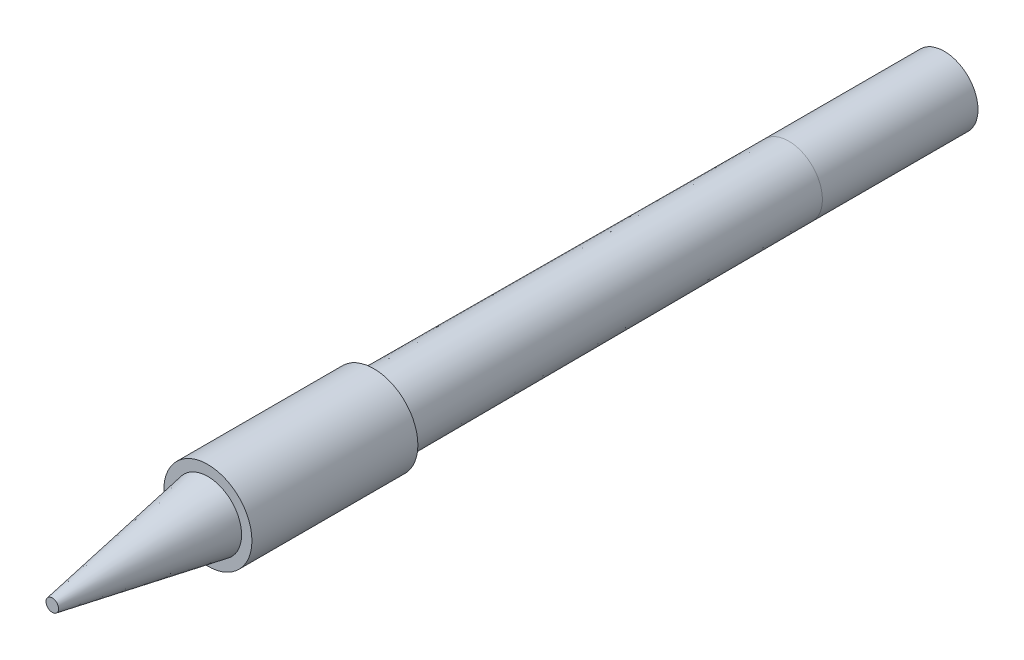
ISO-10303-21;
HEADER;
FILE_DESCRIPTION(('STEP AP214'),'2;1');
FILE_NAME('part.step','',(''),(''),'','','');
FILE_SCHEMA(('AUTOMOTIVE_DESIGN { 1 0 10303 214 1 1 1 1 }'));
ENDSEC;
DATA;
#1=APPLICATION_CONTEXT('core data for automotive mechanical design processes');
#2=APPLICATION_PROTOCOL_DEFINITION('international standard','automotive_design',2000,#1);
#3=PRODUCT_CONTEXT('',#1,'mechanical');
#4=PRODUCT('Part','Part','',(#3));
#5=PRODUCT_RELATED_PRODUCT_CATEGORY('part','',(#4));
#6=PRODUCT_DEFINITION_FORMATION('','',#4);
#7=PRODUCT_DEFINITION_CONTEXT('part definition',#1,'design');
#8=PRODUCT_DEFINITION('design','',#6,#7);
#9=PRODUCT_DEFINITION_SHAPE('','',#8);
#10=(LENGTH_UNIT() NAMED_UNIT(*) SI_UNIT(.MILLI.,.METRE.));
#11=(NAMED_UNIT(*) PLANE_ANGLE_UNIT() SI_UNIT($,.RADIAN.));
#12=(NAMED_UNIT(*) SI_UNIT($,.STERADIAN.) SOLID_ANGLE_UNIT());
#13=UNCERTAINTY_MEASURE_WITH_UNIT(LENGTH_MEASURE(1.E-05),#10,'distance_accuracy_value','');
#14=(GEOMETRIC_REPRESENTATION_CONTEXT(3) GLOBAL_UNCERTAINTY_ASSIGNED_CONTEXT((#13)) GLOBAL_UNIT_ASSIGNED_CONTEXT((#10,
#11,#12)) REPRESENTATION_CONTEXT('',''));
#15=CARTESIAN_POINT('',(0.,0.,0.));
#16=DIRECTION('',(0.,0.,1.));
#17=DIRECTION('',(1.,0.,0.));
#18=AXIS2_PLACEMENT_3D('',#15,#16,#17);
#19=CARTESIAN_POINT('',(0.,0.,0.));
#20=DIRECTION('',(0.,0.,1.));
#21=DIRECTION('',(1.,0.,0.));
#22=AXIS2_PLACEMENT_3D('',#19,#20,#21);
#23=CONICAL_SURFACE('',#22,6.5,0.00349065850398867);
#24=CARTESIAN_POINT('',(0.,0.,80.));
#25=DIRECTION('',(0.,0.,1.));
#26=DIRECTION('',(1.,0.,0.));
#27=AXIS2_PLACEMENT_3D('',#24,#25,#26);
#28=CIRCLE('',#27,6.7792538145277);
#29=CARTESIAN_POINT('',(6.7792538145277,0.,80.));
#30=VERTEX_POINT('',#29);
#31=EDGE_CURVE('E40',#30,#30,#28,.T.);
#32=ORIENTED_EDGE('',*,*,#31,.F.);
#33=EDGE_LOOP('',(#32));
#34=FACE_BOUND('',#33,.T.);
#35=CARTESIAN_POINT('',(0.,0.,0.));
#36=DIRECTION('',(0.,0.,1.));
#37=DIRECTION('',(1.,0.,0.));
#38=AXIS2_PLACEMENT_3D('',#35,#36,#37);
#39=CIRCLE('',#38,6.5);
#40=CARTESIAN_POINT('',(6.5,0.,0.));
#41=VERTEX_POINT('',#40);
#42=EDGE_CURVE('E57',#41,#41,#39,.T.);
#43=ORIENTED_EDGE('',*,*,#42,.T.);
#44=EDGE_LOOP('',(#43));
#45=FACE_BOUND('',#44,.T.);
#46=ADVANCED_FACE('F37',(#34,#45),#23,.T.);
#47=CARTESIAN_POINT('',(0.,0.,-30.));
#48=DIRECTION('',(0.,0.,1.));
#49=DIRECTION('',(1.,0.,0.));
#50=AXIS2_PLACEMENT_3D('',#47,#48,#49);
#51=CYLINDRICAL_SURFACE('',#50,6.5);
#52=CARTESIAN_POINT('',(0.,0.,-30.));
#53=DIRECTION('',(0.,0.,1.));
#54=DIRECTION('',(1.,0.,0.));
#55=AXIS2_PLACEMENT_3D('',#52,#53,#54);
#56=CIRCLE('',#55,6.5);
#57=CARTESIAN_POINT('',(6.5,0.,-30.));
#58=VERTEX_POINT('',#57);
#59=EDGE_CURVE('E48',#58,#58,#56,.T.);
#60=ORIENTED_EDGE('',*,*,#59,.T.);
#61=EDGE_LOOP('',(#60));
#62=FACE_BOUND('',#61,.T.);
#63=ORIENTED_EDGE('',*,*,#42,.F.);
#64=EDGE_LOOP('',(#63));
#65=FACE_BOUND('',#64,.T.);
#66=ADVANCED_FACE('F65',(#62,#65),#51,.T.);
#67=CARTESIAN_POINT('',(0.,0.,-30.));
#68=DIRECTION('',(0.,0.,1.));
#69=DIRECTION('',(1.,0.,0.));
#70=AXIS2_PLACEMENT_3D('',#67,#68,#69);
#71=PLANE('',#70);
#72=ORIENTED_EDGE('',*,*,#59,.F.);
#73=EDGE_LOOP('',(#72));
#74=FACE_BOUND('',#73,.T.);
#75=ADVANCED_FACE('F67',(#74),#71,.F.);
#76=CARTESIAN_POINT('',(0.,0.,112.));
#77=DIRECTION('',(0.,0.,-1.));
#78=DIRECTION('',(-1.,0.,0.));
#79=AXIS2_PLACEMENT_3D('',#76,#77,#78);
#80=CYLINDRICAL_SURFACE('',#79,8.5);
#81=CARTESIAN_POINT('',(0.,0.,112.));
#82=DIRECTION('',(0.,0.,1.));
#83=DIRECTION('',(1.,0.,0.));
#84=AXIS2_PLACEMENT_3D('',#81,#82,#83);
#85=CIRCLE('',#84,8.5);
#86=CARTESIAN_POINT('',(8.5,0.,112.));
#87=VERTEX_POINT('',#86);
#88=EDGE_CURVE('E54',#87,#87,#85,.T.);
#89=ORIENTED_EDGE('',*,*,#88,.F.);
#90=EDGE_LOOP('',(#89));
#91=FACE_BOUND('',#90,.T.);
#92=CARTESIAN_POINT('',(0.,0.,80.));
#93=DIRECTION('',(0.,0.,1.));
#94=DIRECTION('',(1.,0.,0.));
#95=AXIS2_PLACEMENT_3D('',#92,#93,#94);
#96=CIRCLE('',#95,8.5);
#97=CARTESIAN_POINT('',(8.5,0.,80.));
#98=VERTEX_POINT('',#97);
#99=EDGE_CURVE('E53',#98,#98,#96,.T.);
#100=ORIENTED_EDGE('',*,*,#99,.T.);
#101=EDGE_LOOP('',(#100));
#102=FACE_BOUND('',#101,.T.);
#103=ADVANCED_FACE('F73',(#91,#102),#80,.T.);
#104=CARTESIAN_POINT('',(0.,0.,112.));
#105=DIRECTION('',(0.,0.,1.));
#106=DIRECTION('',(1.,0.,0.));
#107=AXIS2_PLACEMENT_3D('',#104,#105,#106);
#108=PLANE('',#107);
#109=CARTESIAN_POINT('',(0.,0.,112.));
#110=DIRECTION('',(0.,0.,1.));
#111=DIRECTION('',(1.,0.,0.));
#112=AXIS2_PLACEMENT_3D('',#109,#110,#111);
#113=CIRCLE('',#112,6.5);
#114=CARTESIAN_POINT('',(6.5,0.,112.));
#115=VERTEX_POINT('',#114);
#116=EDGE_CURVE('E10',#115,#115,#113,.T.);
#117=ORIENTED_EDGE('',*,*,#116,.F.);
#118=EDGE_LOOP('',(#117));
#119=FACE_BOUND('',#118,.T.);
#120=ORIENTED_EDGE('',*,*,#88,.T.);
#121=EDGE_LOOP('',(#120));
#122=FACE_BOUND('',#121,.T.);
#123=ADVANCED_FACE('F80',(#119,#122),#108,.T.);
#124=CARTESIAN_POINT('',(0.,0.,80.));
#125=DIRECTION('',(0.,0.,1.));
#126=DIRECTION('',(1.,0.,0.));
#127=AXIS2_PLACEMENT_3D('',#124,#125,#126);
#128=PLANE('',#127);
#129=ORIENTED_EDGE('',*,*,#31,.T.);
#130=EDGE_LOOP('',(#129));
#131=FACE_BOUND('',#130,.T.);
#132=ORIENTED_EDGE('',*,*,#99,.F.);
#133=EDGE_LOOP('',(#132));
#134=FACE_BOUND('',#133,.T.);
#135=ADVANCED_FACE('F82',(#131,#134),#128,.F.);
#136=CARTESIAN_POINT('',(0.,0.,112.));
#137=DIRECTION('',(0.,0.,-1.));
#138=DIRECTION('',(1.,0.,0.));
#139=AXIS2_PLACEMENT_3D('',#136,#137,#138);
#140=CONICAL_SURFACE('',#139,6.5,0.174532925199433);
#141=CARTESIAN_POINT('',(0.,0.,142.));
#142=DIRECTION('',(0.,0.,1.));
#143=DIRECTION('',(1.,0.,0.));
#144=AXIS2_PLACEMENT_3D('',#141,#142,#143);
#145=CIRCLE('',#144,1.21019057874604);
#146=CARTESIAN_POINT('',(1.21019057874604,0.,142.));
#147=VERTEX_POINT('',#146);
#148=EDGE_CURVE('E50',#147,#147,#145,.T.);
#149=CARTESIAN_POINT('',(1.21019057874604,0.,142.));
#150=CARTESIAN_POINT('',(1.26529276021743,0.,141.6875));
#151=CARTESIAN_POINT('',(1.32039494168883,0.,141.375));
#152=CARTESIAN_POINT('',(1.43059930463162,0.,140.75));
#153=CARTESIAN_POINT('',(1.48570148610302,0.,140.4375));
#154=CARTESIAN_POINT('',(1.59590584904581,0.,139.8125));
#155=CARTESIAN_POINT('',(1.6510080305172,0.,139.5));
#156=CARTESIAN_POINT('',(1.76121239345999,0.,138.875));
#157=CARTESIAN_POINT('',(1.81631457493139,0.,138.5625));
#158=CARTESIAN_POINT('',(1.92651893787418,0.,137.9375));
#159=CARTESIAN_POINT('',(1.98162111934557,0.,137.625));
#160=CARTESIAN_POINT('',(2.09182548228836,0.,137.));
#161=CARTESIAN_POINT('',(2.14692766375976,0.,136.6875));
#162=CARTESIAN_POINT('',(2.25713202670255,0.,136.0625));
#163=CARTESIAN_POINT('',(2.31223420817395,0.,135.75));
#164=CARTESIAN_POINT('',(2.42243857111674,0.,135.125));
#165=CARTESIAN_POINT('',(2.47754075258813,0.,134.8125));
#166=CARTESIAN_POINT('',(2.58774511553092,0.,134.1875));
#167=CARTESIAN_POINT('',(2.64284729700232,0.,133.875));
#168=CARTESIAN_POINT('',(2.75305165994511,0.,133.25));
#169=CARTESIAN_POINT('',(2.8081538414165,0.,132.9375));
#170=CARTESIAN_POINT('',(2.9183582043593,0.,132.3125));
#171=CARTESIAN_POINT('',(2.97346038583069,0.,132.));
#172=CARTESIAN_POINT('',(3.08366474877348,0.,131.375));
#173=CARTESIAN_POINT('',(3.13876693024488,0.,131.0625));
#174=CARTESIAN_POINT('',(3.24897129318767,0.,130.4375));
#175=CARTESIAN_POINT('',(3.30407347465907,0.,130.125));
#176=CARTESIAN_POINT('',(3.41427783760186,0.,129.5));
#177=CARTESIAN_POINT('',(3.46938001907325,0.,129.1875));
#178=CARTESIAN_POINT('',(3.57958438201604,0.,128.5625));
#179=CARTESIAN_POINT('',(3.63468656348744,0.,128.25));
#180=CARTESIAN_POINT('',(3.74489092643023,0.,127.625));
#181=CARTESIAN_POINT('',(3.79999310790162,0.,127.3125));
#182=CARTESIAN_POINT('',(3.91019747084441,0.,126.6875));
#183=CARTESIAN_POINT('',(3.96529965231581,0.,126.375));
#184=CARTESIAN_POINT('',(4.0755040152586,0.,125.75));
#185=CARTESIAN_POINT('',(4.13060619673,0.,125.4375));
#186=CARTESIAN_POINT('',(4.24081055967279,0.,124.8125));
#187=CARTESIAN_POINT('',(4.29591274114418,0.,124.5));
#188=CARTESIAN_POINT('',(4.40611710408697,0.,123.875));
#189=CARTESIAN_POINT('',(4.46121928555837,0.,123.5625));
#190=CARTESIAN_POINT('',(4.57142364850116,0.,122.9375));
#191=CARTESIAN_POINT('',(4.62652582997255,0.,122.625));
#192=CARTESIAN_POINT('',(4.73673019291534,0.,122.));
#193=CARTESIAN_POINT('',(4.79183237438674,0.,121.6875));
#194=CARTESIAN_POINT('',(4.90203673732953,0.,121.0625));
#195=CARTESIAN_POINT('',(4.95713891880093,0.,120.75));
#196=CARTESIAN_POINT('',(5.06734328174372,0.,120.125));
#197=CARTESIAN_POINT('',(5.12244546321511,0.,119.8125));
#198=CARTESIAN_POINT('',(5.23264982615791,0.,119.1875));
#199=CARTESIAN_POINT('',(5.2877520076293,0.,118.875));
#200=CARTESIAN_POINT('',(5.39795637057209,0.,118.25));
#201=CARTESIAN_POINT('',(5.45305855204349,0.,117.9375));
#202=CARTESIAN_POINT('',(5.56326291498628,0.,117.3125));
#203=CARTESIAN_POINT('',(5.61836509645767,0.,117.));
#204=CARTESIAN_POINT('',(5.72856945940046,0.,116.375));
#205=CARTESIAN_POINT('',(5.78367164087186,0.,116.0625));
#206=CARTESIAN_POINT('',(5.89387600381465,0.,115.4375));
#207=CARTESIAN_POINT('',(5.94897818528605,0.,115.125));
#208=CARTESIAN_POINT('',(6.05918254822884,0.,114.5));
#209=CARTESIAN_POINT('',(6.11428472970023,0.,114.1875));
#210=CARTESIAN_POINT('',(6.22448909264302,0.,113.5625));
#211=CARTESIAN_POINT('',(6.27959127411442,0.,113.25));
#212=CARTESIAN_POINT('',(6.38979563705721,0.,112.625));
#213=CARTESIAN_POINT('',(6.4448978185286,0.,112.3125));
#214=CARTESIAN_POINT('',(6.5,0.,112.));
#215=B_SPLINE_CURVE_WITH_KNOTS('',3,(#149,#150,#151,#152,#153,#154,#155,#156,#157,#158,#159,
#160,#161,#162,#163,#164,#165,#166,#167,#168,#169,#170,#171,#172,#173,#174,#175,#176,#177,#178,
#179,#180,#181,#182,#183,#184,#185,#186,#187,#188,#189,#190,#191,#192,#193,#194,#195,#196,#197,
#198,#199,#200,#201,#202,#203,#204,#205,#206,#207,#208,#209,#210,#211,#212,#213,#214),
.UNSPECIFIED.,.F.,.F.,(4,2,2,2,2,2,2,2,2,2,2,2,2,2,2,2,2,2,2,2,2,2,2,2,2,2,2,2,2,2,2,2,4),(0.,
0.951962448642894,1.90392489728579,2.85588734592868,3.80784979457155,4.75981224321444,
5.71177469185733,6.66373714050023,7.61569958914309,8.56766203778599,9.51962448642888,
10.4715869350717,11.4235493837146,12.3755118323575,13.3274742810004,14.2794367296433,
15.2313991782862,16.1833616269291,17.135324075572,18.0872865242148,19.0392489728577,
19.9912114215006,20.9431738701435,21.8951363187864,22.8470987674293,23.7990612160722,
24.7510236647151,25.7029861133579,26.6549485620008,27.6069110106437,28.5588734592866,
29.5108359079295,30.4627983565724),.UNSPECIFIED.);
#216=EDGE_CURVE('BSEAM85',#147,#115,#215,.T.);
#217=ORIENTED_EDGE('',*,*,#148,.F.);
#218=ORIENTED_EDGE('',*,*,#116,.T.);
#219=ORIENTED_EDGE('',*,*,#216,.T.);
#220=ORIENTED_EDGE('',*,*,#216,.F.);
#221=EDGE_LOOP('',(#217,#219,#218,#220));
#222=FACE_BOUND('',#221,.T.);
#223=ADVANCED_FACE('F85',(#222),#140,.T.);
#224=CARTESIAN_POINT('',(0.,0.,142.));
#225=DIRECTION('',(0.,0.,1.));
#226=DIRECTION('',(1.,0.,0.));
#227=AXIS2_PLACEMENT_3D('',#224,#225,#226);
#228=PLANE('',#227);
#229=ORIENTED_EDGE('',*,*,#148,.T.);
#230=EDGE_LOOP('',(#229));
#231=FACE_BOUND('',#230,.T.);
#232=ADVANCED_FACE('F92',(#231),#228,.T.);
#233=CLOSED_SHELL('',(#46,#66,#75,#103,#123,#135,#223,#232));
#234=MANIFOLD_SOLID_BREP('B2',#233);
#235=ADVANCED_BREP_SHAPE_REPRESENTATION('',(#18,#234),#14);
#236=SHAPE_DEFINITION_REPRESENTATION(#9,#235);
ENDSEC;
END-ISO-10303-21;
